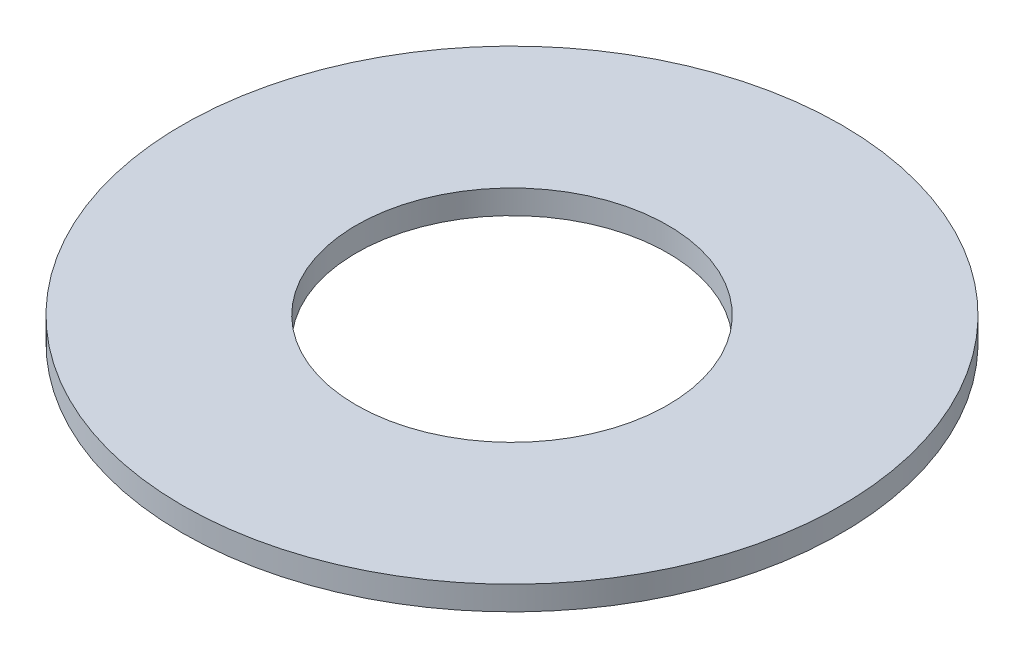
ISO-10303-21;
HEADER;
FILE_DESCRIPTION(('STEP AP214'),'2;1');
FILE_NAME('part.step','',(''),(''),'','','');
FILE_SCHEMA(('AUTOMOTIVE_DESIGN { 1 0 10303 214 1 1 1 1 }'));
ENDSEC;
DATA;
#1=APPLICATION_CONTEXT('core data for automotive mechanical design processes');
#2=APPLICATION_PROTOCOL_DEFINITION('international standard','automotive_design',2000,#1);
#3=PRODUCT_CONTEXT('',#1,'mechanical');
#4=PRODUCT('Part','Part','',(#3));
#5=PRODUCT_RELATED_PRODUCT_CATEGORY('part','',(#4));
#6=PRODUCT_DEFINITION_FORMATION('','',#4);
#7=PRODUCT_DEFINITION_CONTEXT('part definition',#1,'design');
#8=PRODUCT_DEFINITION('design','',#6,#7);
#9=PRODUCT_DEFINITION_SHAPE('','',#8);
#10=(LENGTH_UNIT() NAMED_UNIT(*) SI_UNIT(.MILLI.,.METRE.));
#11=(NAMED_UNIT(*) PLANE_ANGLE_UNIT() SI_UNIT($,.RADIAN.));
#12=(NAMED_UNIT(*) SI_UNIT($,.STERADIAN.) SOLID_ANGLE_UNIT());
#13=UNCERTAINTY_MEASURE_WITH_UNIT(LENGTH_MEASURE(1.E-05),#10,'distance_accuracy_value','');
#14=(GEOMETRIC_REPRESENTATION_CONTEXT(3) GLOBAL_UNCERTAINTY_ASSIGNED_CONTEXT((#13)) GLOBAL_UNIT_ASSIGNED_CONTEXT((#10,
#11,#12)) REPRESENTATION_CONTEXT('',''));
#15=CARTESIAN_POINT('',(0.,0.,0.));
#16=DIRECTION('',(0.,0.,1.));
#17=DIRECTION('',(1.,0.,0.));
#18=AXIS2_PLACEMENT_3D('',#15,#16,#17);
#19=CARTESIAN_POINT('',(0.,0.4,0.));
#20=DIRECTION('',(0.,1.,0.));
#21=DIRECTION('',(0.,0.,1.));
#22=AXIS2_PLACEMENT_3D('',#19,#20,#21);
#23=PLANE('',#22);
#24=CARTESIAN_POINT('',(0.,0.4,0.));
#25=DIRECTION('',(0.,1.,0.));
#26=DIRECTION('',(0.,0.,1.));
#27=AXIS2_PLACEMENT_3D('',#24,#25,#26);
#28=CIRCLE('',#27,5.5);
#29=CARTESIAN_POINT('',(0.,0.4,5.5));
#30=VERTEX_POINT('',#29);
#31=EDGE_CURVE('E10',#30,#30,#28,.T.);
#32=ORIENTED_EDGE('',*,*,#31,.T.);
#33=EDGE_LOOP('',(#32));
#34=FACE_BOUND('',#33,.T.);
#35=CARTESIAN_POINT('',(0.,0.4,0.));
#36=DIRECTION('',(0.,1.,0.));
#37=DIRECTION('',(0.,0.,1.));
#38=AXIS2_PLACEMENT_3D('',#35,#36,#37);
#39=CIRCLE('',#38,2.6);
#40=CARTESIAN_POINT('',(0.,0.4,2.6));
#41=VERTEX_POINT('',#40);
#42=EDGE_CURVE('E44',#41,#41,#39,.T.);
#43=ORIENTED_EDGE('',*,*,#42,.F.);
#44=EDGE_LOOP('',(#43));
#45=FACE_BOUND('',#44,.T.);
#46=ADVANCED_FACE('F33',(#34,#45),#23,.T.);
#47=CARTESIAN_POINT('',(0.,0.,0.));
#48=DIRECTION('',(0.,1.,0.));
#49=DIRECTION('',(0.,0.,1.));
#50=AXIS2_PLACEMENT_3D('',#47,#48,#49);
#51=PLANE('',#50);
#52=CARTESIAN_POINT('',(0.,0.,0.));
#53=DIRECTION('',(0.,1.,0.));
#54=DIRECTION('',(0.,0.,1.));
#55=AXIS2_PLACEMENT_3D('',#52,#53,#54);
#56=CIRCLE('',#55,5.5);
#57=CARTESIAN_POINT('',(0.,0.,5.5));
#58=VERTEX_POINT('',#57);
#59=EDGE_CURVE('E37',#58,#58,#56,.T.);
#60=ORIENTED_EDGE('',*,*,#59,.F.);
#61=EDGE_LOOP('',(#60));
#62=FACE_BOUND('',#61,.T.);
#63=CARTESIAN_POINT('',(0.,0.,0.));
#64=DIRECTION('',(0.,1.,0.));
#65=DIRECTION('',(0.,0.,1.));
#66=AXIS2_PLACEMENT_3D('',#63,#64,#65);
#67=CIRCLE('',#66,2.6);
#68=CARTESIAN_POINT('',(0.,0.,2.6));
#69=VERTEX_POINT('',#68);
#70=EDGE_CURVE('E46',#69,#69,#67,.T.);
#71=ORIENTED_EDGE('',*,*,#70,.T.);
#72=EDGE_LOOP('',(#71));
#73=FACE_BOUND('',#72,.T.);
#74=ADVANCED_FACE('F56',(#62,#73),#51,.F.);
#75=CARTESIAN_POINT('',(0.,0.4,0.));
#76=DIRECTION('',(0.,-1.,0.));
#77=DIRECTION('',(0.,0.,-1.));
#78=AXIS2_PLACEMENT_3D('',#75,#76,#77);
#79=CYLINDRICAL_SURFACE('',#78,5.5);
#80=ORIENTED_EDGE('',*,*,#31,.F.);
#81=EDGE_LOOP('',(#80));
#82=FACE_BOUND('',#81,.T.);
#83=ORIENTED_EDGE('',*,*,#59,.T.);
#84=EDGE_LOOP('',(#83));
#85=FACE_BOUND('',#84,.T.);
#86=ADVANCED_FACE('F35',(#82,#85),#79,.T.);
#87=CARTESIAN_POINT('',(0.,0.4,0.));
#88=DIRECTION('',(0.,-1.,0.));
#89=DIRECTION('',(0.,0.,-1.));
#90=AXIS2_PLACEMENT_3D('',#87,#88,#89);
#91=CYLINDRICAL_SURFACE('',#90,2.6);
#92=ORIENTED_EDGE('',*,*,#42,.T.);
#93=EDGE_LOOP('',(#92));
#94=FACE_BOUND('',#93,.T.);
#95=ORIENTED_EDGE('',*,*,#70,.F.);
#96=EDGE_LOOP('',(#95));
#97=FACE_BOUND('',#96,.T.);
#98=ADVANCED_FACE('F52',(#94,#97),#91,.F.);
#99=CLOSED_SHELL('',(#46,#74,#86,#98));
#100=MANIFOLD_SOLID_BREP('B2',#99);
#101=ADVANCED_BREP_SHAPE_REPRESENTATION('',(#18,#100),#14);
#102=SHAPE_DEFINITION_REPRESENTATION(#9,#101);
ENDSEC;
END-ISO-10303-21;
